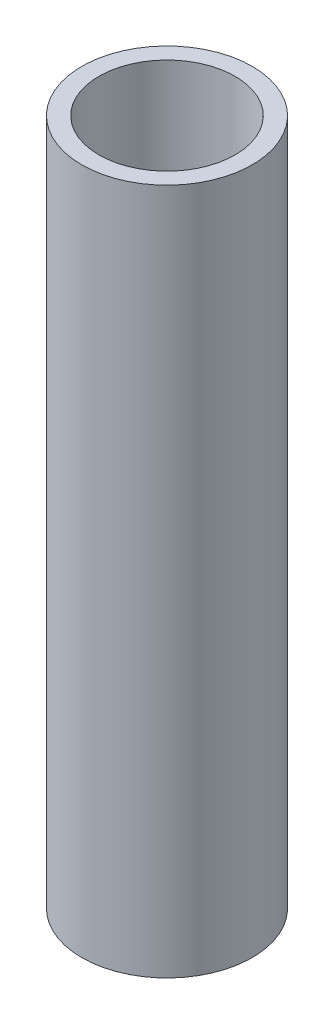
ISO-10303-21;
HEADER;
FILE_DESCRIPTION(('STEP AP214'),'2;1');
FILE_NAME('part.step','',(''),(''),'','','');
FILE_SCHEMA(('AUTOMOTIVE_DESIGN { 1 0 10303 214 1 1 1 1 }'));
ENDSEC;
DATA;
#1=APPLICATION_CONTEXT('core data for automotive mechanical design processes');
#2=APPLICATION_PROTOCOL_DEFINITION('international standard','automotive_design',2000,#1);
#3=PRODUCT_CONTEXT('',#1,'mechanical');
#4=PRODUCT('Part','Part','',(#3));
#5=PRODUCT_RELATED_PRODUCT_CATEGORY('part','',(#4));
#6=PRODUCT_DEFINITION_FORMATION('','',#4);
#7=PRODUCT_DEFINITION_CONTEXT('part definition',#1,'design');
#8=PRODUCT_DEFINITION('design','',#6,#7);
#9=PRODUCT_DEFINITION_SHAPE('','',#8);
#10=(LENGTH_UNIT() NAMED_UNIT(*) SI_UNIT(.MILLI.,.METRE.));
#11=(NAMED_UNIT(*) PLANE_ANGLE_UNIT() SI_UNIT($,.RADIAN.));
#12=(NAMED_UNIT(*) SI_UNIT($,.STERADIAN.) SOLID_ANGLE_UNIT());
#13=UNCERTAINTY_MEASURE_WITH_UNIT(LENGTH_MEASURE(1.E-05),#10,'distance_accuracy_value','');
#14=(GEOMETRIC_REPRESENTATION_CONTEXT(3) GLOBAL_UNCERTAINTY_ASSIGNED_CONTEXT((#13)) GLOBAL_UNIT_ASSIGNED_CONTEXT((#10,
#11,#12)) REPRESENTATION_CONTEXT('',''));
#15=CARTESIAN_POINT('',(0.,0.,0.));
#16=DIRECTION('',(0.,0.,1.));
#17=DIRECTION('',(1.,0.,0.));
#18=AXIS2_PLACEMENT_3D('',#15,#16,#17);
#19=CARTESIAN_POINT('',(0.,-100.,0.));
#20=DIRECTION('',(0.,1.,0.));
#21=DIRECTION('',(0.,0.,1.));
#22=AXIS2_PLACEMENT_3D('',#19,#20,#21);
#23=CYLINDRICAL_SURFACE('',#22,12.4187);
#24=CARTESIAN_POINT('',(0.,-100.,0.));
#25=DIRECTION('',(0.,1.,0.));
#26=DIRECTION('',(0.,0.,1.));
#27=AXIS2_PLACEMENT_3D('',#24,#25,#26);
#28=CIRCLE('',#27,12.4187);
#29=CARTESIAN_POINT('',(0.,-100.,12.4187));
#30=VERTEX_POINT('',#29);
#31=EDGE_CURVE('E10',#30,#30,#28,.T.);
#32=ORIENTED_EDGE('',*,*,#31,.T.);
#33=EDGE_LOOP('',(#32));
#34=FACE_BOUND('',#33,.T.);
#35=CARTESIAN_POINT('',(0.,0.,0.));
#36=DIRECTION('',(0.,1.,0.));
#37=DIRECTION('',(0.,0.,1.));
#38=AXIS2_PLACEMENT_3D('',#35,#36,#37);
#39=CIRCLE('',#38,12.4187);
#40=CARTESIAN_POINT('',(0.,0.,12.4187));
#41=VERTEX_POINT('',#40);
#42=EDGE_CURVE('E34',#41,#41,#39,.T.);
#43=ORIENTED_EDGE('',*,*,#42,.F.);
#44=EDGE_LOOP('',(#43));
#45=FACE_BOUND('',#44,.T.);
#46=ADVANCED_FACE('F31',(#34,#45),#23,.T.);
#47=CARTESIAN_POINT('',(0.,-100.,0.));
#48=DIRECTION('',(0.,1.,0.));
#49=DIRECTION('',(0.,0.,1.));
#50=AXIS2_PLACEMENT_3D('',#47,#48,#49);
#51=PLANE('',#50);
#52=ORIENTED_EDGE('',*,*,#31,.F.);
#53=EDGE_LOOP('',(#52));
#54=FACE_BOUND('',#53,.T.);
#55=ADVANCED_FACE('F60',(#54),#51,.F.);
#56=CARTESIAN_POINT('',(0.,0.,0.));
#57=DIRECTION('',(0.,1.,0.));
#58=DIRECTION('',(0.,0.,1.));
#59=AXIS2_PLACEMENT_3D('',#56,#57,#58);
#60=PLANE('',#59);
#61=CARTESIAN_POINT('',(0.,0.,0.));
#62=DIRECTION('',(0.,1.,0.));
#63=DIRECTION('',(0.,0.,1.));
#64=AXIS2_PLACEMENT_3D('',#61,#62,#63);
#65=CIRCLE('',#64,9.9187);
#66=CARTESIAN_POINT('',(0.,0.,9.9187));
#67=VERTEX_POINT('',#66);
#68=EDGE_CURVE('E43',#67,#67,#65,.T.);
#69=ORIENTED_EDGE('',*,*,#68,.F.);
#70=EDGE_LOOP('',(#69));
#71=FACE_BOUND('',#70,.T.);
#72=ORIENTED_EDGE('',*,*,#42,.T.);
#73=EDGE_LOOP('',(#72));
#74=FACE_BOUND('',#73,.T.);
#75=ADVANCED_FACE('F54',(#71,#74),#60,.T.);
#76=CARTESIAN_POINT('',(0.,-30.,0.));
#77=DIRECTION('',(0.,1.,0.));
#78=DIRECTION('',(0.,0.,1.));
#79=AXIS2_PLACEMENT_3D('',#76,#77,#78);
#80=CYLINDRICAL_SURFACE('',#79,9.9187);
#81=CARTESIAN_POINT('',(0.,-30.,0.));
#82=DIRECTION('',(0.,1.,0.));
#83=DIRECTION('',(0.,0.,1.));
#84=AXIS2_PLACEMENT_3D('',#81,#82,#83);
#85=CIRCLE('',#84,9.9187);
#86=CARTESIAN_POINT('',(0.,-30.,9.9187));
#87=VERTEX_POINT('',#86);
#88=EDGE_CURVE('E41',#87,#87,#85,.T.);
#89=ORIENTED_EDGE('',*,*,#88,.F.);
#90=EDGE_LOOP('',(#89));
#91=FACE_BOUND('',#90,.T.);
#92=ORIENTED_EDGE('',*,*,#68,.T.);
#93=EDGE_LOOP('',(#92));
#94=FACE_BOUND('',#93,.T.);
#95=ADVANCED_FACE('F51',(#91,#94),#80,.F.);
#96=CARTESIAN_POINT('',(0.,-30.,0.));
#97=DIRECTION('',(0.,1.,0.));
#98=DIRECTION('',(0.,0.,1.));
#99=AXIS2_PLACEMENT_3D('',#96,#97,#98);
#100=PLANE('',#99);
#101=ORIENTED_EDGE('',*,*,#88,.T.);
#102=EDGE_LOOP('',(#101));
#103=FACE_BOUND('',#102,.T.);
#104=ADVANCED_FACE('F49',(#103),#100,.T.);
#105=CLOSED_SHELL('',(#46,#55,#75,#95,#104));
#106=MANIFOLD_SOLID_BREP('B2',#105);
#107=ADVANCED_BREP_SHAPE_REPRESENTATION('',(#18,#106),#14);
#108=SHAPE_DEFINITION_REPRESENTATION(#9,#107);
ENDSEC;
END-ISO-10303-21;
